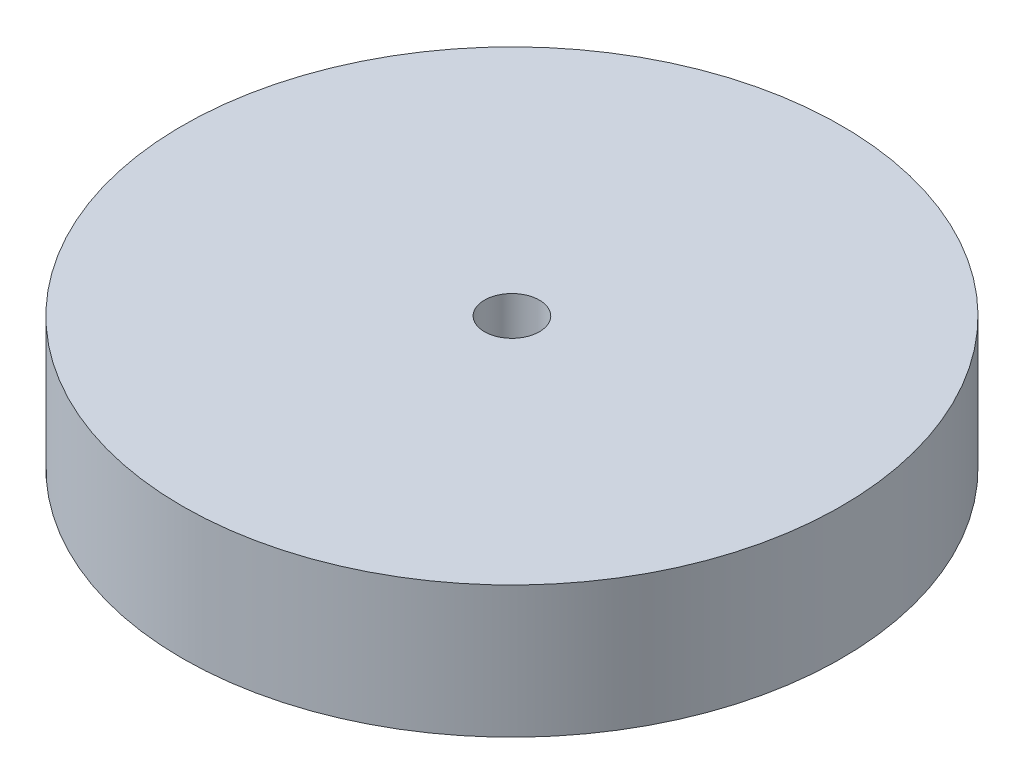
ISO-10303-21;
HEADER;
FILE_DESCRIPTION(('STEP AP214'),'2;1');
FILE_NAME('part.step','',(''),(''),'','','');
FILE_SCHEMA(('AUTOMOTIVE_DESIGN { 1 0 10303 214 1 1 1 1 }'));
ENDSEC;
DATA;
#1=APPLICATION_CONTEXT('core data for automotive mechanical design processes');
#2=APPLICATION_PROTOCOL_DEFINITION('international standard','automotive_design',2000,#1);
#3=PRODUCT_CONTEXT('',#1,'mechanical');
#4=PRODUCT('Part','Part','',(#3));
#5=PRODUCT_RELATED_PRODUCT_CATEGORY('part','',(#4));
#6=PRODUCT_DEFINITION_FORMATION('','',#4);
#7=PRODUCT_DEFINITION_CONTEXT('part definition',#1,'design');
#8=PRODUCT_DEFINITION('design','',#6,#7);
#9=PRODUCT_DEFINITION_SHAPE('','',#8);
#10=(LENGTH_UNIT() NAMED_UNIT(*) SI_UNIT(.MILLI.,.METRE.));
#11=(NAMED_UNIT(*) PLANE_ANGLE_UNIT() SI_UNIT($,.RADIAN.));
#12=(NAMED_UNIT(*) SI_UNIT($,.STERADIAN.) SOLID_ANGLE_UNIT());
#13=UNCERTAINTY_MEASURE_WITH_UNIT(LENGTH_MEASURE(1.E-05),#10,'distance_accuracy_value','');
#14=(GEOMETRIC_REPRESENTATION_CONTEXT(3) GLOBAL_UNCERTAINTY_ASSIGNED_CONTEXT((#13)) GLOBAL_UNIT_ASSIGNED_CONTEXT((#10,
#11,#12)) REPRESENTATION_CONTEXT('',''));
#15=CARTESIAN_POINT('',(0.,0.,0.));
#16=DIRECTION('',(0.,0.,1.));
#17=DIRECTION('',(1.,0.,0.));
#18=AXIS2_PLACEMENT_3D('',#15,#16,#17);
#19=CARTESIAN_POINT('',(0.,12.,0.));
#20=DIRECTION('',(0.,-1.,0.));
#21=DIRECTION('',(0.,0.,-1.));
#22=AXIS2_PLACEMENT_3D('',#19,#20,#21);
#23=CYLINDRICAL_SURFACE('',#22,30.);
#24=CARTESIAN_POINT('',(0.,12.,0.));
#25=DIRECTION('',(0.,1.,0.));
#26=DIRECTION('',(0.,0.,1.));
#27=AXIS2_PLACEMENT_3D('',#24,#25,#26);
#28=CIRCLE('',#27,30.);
#29=CARTESIAN_POINT('',(0.,12.,30.));
#30=VERTEX_POINT('',#29);
#31=EDGE_CURVE('E10',#30,#30,#28,.T.);
#32=ORIENTED_EDGE('',*,*,#31,.F.);
#33=EDGE_LOOP('',(#32));
#34=FACE_BOUND('',#33,.T.);
#35=CARTESIAN_POINT('',(0.,0.,0.));
#36=DIRECTION('',(0.,1.,0.));
#37=DIRECTION('',(0.,0.,1.));
#38=AXIS2_PLACEMENT_3D('',#35,#36,#37);
#39=CIRCLE('',#38,30.);
#40=CARTESIAN_POINT('',(0.,0.,30.));
#41=VERTEX_POINT('',#40);
#42=EDGE_CURVE('E40',#41,#41,#39,.T.);
#43=ORIENTED_EDGE('',*,*,#42,.T.);
#44=EDGE_LOOP('',(#43));
#45=FACE_BOUND('',#44,.T.);
#46=ADVANCED_FACE('F37',(#34,#45),#23,.T.);
#47=CARTESIAN_POINT('',(0.,12.,0.));
#48=DIRECTION('',(0.,1.,0.));
#49=DIRECTION('',(0.,0.,1.));
#50=AXIS2_PLACEMENT_3D('',#47,#48,#49);
#51=PLANE('',#50);
#52=CARTESIAN_POINT('',(0.,12.,0.));
#53=DIRECTION('',(0.,1.,0.));
#54=DIRECTION('',(0.,0.,1.));
#55=AXIS2_PLACEMENT_3D('',#52,#53,#54);
#56=CIRCLE('',#55,2.5);
#57=CARTESIAN_POINT('',(0.,12.,2.5));
#58=VERTEX_POINT('',#57);
#59=EDGE_CURVE('E49',#58,#58,#56,.T.);
#60=ORIENTED_EDGE('',*,*,#59,.F.);
#61=EDGE_LOOP('',(#60));
#62=FACE_BOUND('',#61,.T.);
#63=ORIENTED_EDGE('',*,*,#31,.T.);
#64=EDGE_LOOP('',(#63));
#65=FACE_BOUND('',#64,.T.);
#66=ADVANCED_FACE('F80',(#62,#65),#51,.T.);
#67=CARTESIAN_POINT('',(0.,0.,0.));
#68=DIRECTION('',(0.,1.,0.));
#69=DIRECTION('',(0.,0.,1.));
#70=AXIS2_PLACEMENT_3D('',#67,#68,#69);
#71=PLANE('',#70);
#72=CARTESIAN_POINT('',(0.,0.,0.));
#73=DIRECTION('',(0.,-1.,0.));
#74=DIRECTION('',(0.,0.,-1.));
#75=AXIS2_PLACEMENT_3D('',#72,#73,#74);
#76=CIRCLE('',#75,5.);
#77=CARTESIAN_POINT('',(0.,0.,-5.));
#78=VERTEX_POINT('',#77);
#79=EDGE_CURVE('E59',#78,#78,#76,.T.);
#80=ORIENTED_EDGE('',*,*,#79,.F.);
#81=EDGE_LOOP('',(#80));
#82=FACE_BOUND('',#81,.T.);
#83=ORIENTED_EDGE('',*,*,#42,.F.);
#84=EDGE_LOOP('',(#83));
#85=FACE_BOUND('',#84,.T.);
#86=ADVANCED_FACE('F76',(#82,#85),#71,.F.);
#87=CARTESIAN_POINT('',(0.,6.,0.));
#88=DIRECTION('',(0.,1.,0.));
#89=DIRECTION('',(0.,0.,1.));
#90=AXIS2_PLACEMENT_3D('',#87,#88,#89);
#91=CYLINDRICAL_SURFACE('',#90,2.5);
#92=CARTESIAN_POINT('',(0.,6.,0.));
#93=DIRECTION('',(0.,1.,0.));
#94=DIRECTION('',(0.,0.,1.));
#95=AXIS2_PLACEMENT_3D('',#92,#93,#94);
#96=CIRCLE('',#95,2.5);
#97=CARTESIAN_POINT('',(0.,6.,2.5));
#98=VERTEX_POINT('',#97);
#99=EDGE_CURVE('E54',#98,#98,#96,.T.);
#100=ORIENTED_EDGE('',*,*,#99,.F.);
#101=EDGE_LOOP('',(#100));
#102=FACE_BOUND('',#101,.T.);
#103=ORIENTED_EDGE('',*,*,#59,.T.);
#104=EDGE_LOOP('',(#103));
#105=FACE_BOUND('',#104,.T.);
#106=ADVANCED_FACE('F79',(#102,#105),#91,.F.);
#107=CARTESIAN_POINT('',(0.,6.,0.));
#108=DIRECTION('',(0.,-1.,0.));
#109=DIRECTION('',(0.,0.,-1.));
#110=AXIS2_PLACEMENT_3D('',#107,#108,#109);
#111=PLANE('',#110);
#112=CARTESIAN_POINT('',(0.,6.,0.));
#113=DIRECTION('',(0.,-1.,0.));
#114=DIRECTION('',(0.,0.,-1.));
#115=AXIS2_PLACEMENT_3D('',#112,#113,#114);
#116=CIRCLE('',#115,5.);
#117=CARTESIAN_POINT('',(0.,6.,-5.));
#118=VERTEX_POINT('',#117);
#119=EDGE_CURVE('E58',#118,#118,#116,.T.);
#120=ORIENTED_EDGE('',*,*,#119,.T.);
#121=EDGE_LOOP('',(#120));
#122=FACE_BOUND('',#121,.T.);
#123=ORIENTED_EDGE('',*,*,#99,.T.);
#124=EDGE_LOOP('',(#123));
#125=FACE_BOUND('',#124,.T.);
#126=ADVANCED_FACE('F67',(#122,#125),#111,.T.);
#127=CARTESIAN_POINT('',(0.,6.,0.));
#128=DIRECTION('',(0.,-1.,0.));
#129=DIRECTION('',(0.,0.,-1.));
#130=AXIS2_PLACEMENT_3D('',#127,#128,#129);
#131=CYLINDRICAL_SURFACE('',#130,5.);
#132=ORIENTED_EDGE('',*,*,#119,.F.);
#133=EDGE_LOOP('',(#132));
#134=FACE_BOUND('',#133,.T.);
#135=ORIENTED_EDGE('',*,*,#79,.T.);
#136=EDGE_LOOP('',(#135));
#137=FACE_BOUND('',#136,.T.);
#138=ADVANCED_FACE('F70',(#134,#137),#131,.F.);
#139=CLOSED_SHELL('',(#46,#66,#86,#106,#126,#138));
#140=MANIFOLD_SOLID_BREP('B2',#139);
#141=ADVANCED_BREP_SHAPE_REPRESENTATION('',(#18,#140),#14);
#142=SHAPE_DEFINITION_REPRESENTATION(#9,#141);
ENDSEC;
END-ISO-10303-21;
